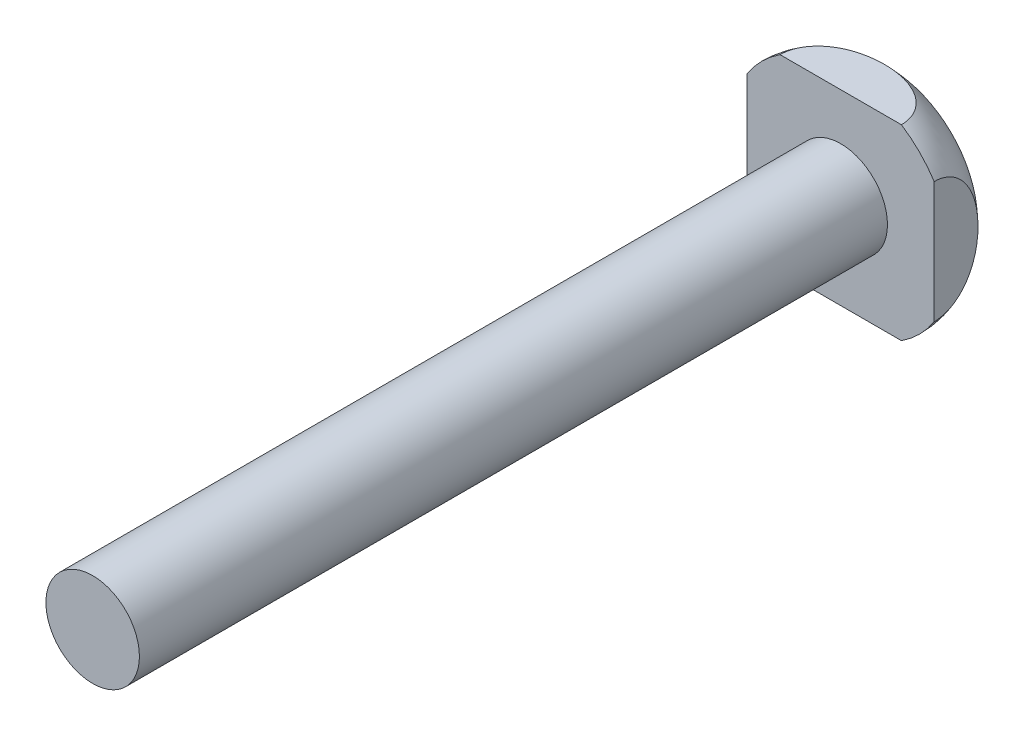
ISO-10303-21;
HEADER;
FILE_DESCRIPTION(('STEP AP214'),'2;1');
FILE_NAME('part.step','',(''),(''),'','','');
FILE_SCHEMA(('AUTOMOTIVE_DESIGN { 1 0 10303 214 1 1 1 1 }'));
ENDSEC;
DATA;
#1=APPLICATION_CONTEXT('core data for automotive mechanical design processes');
#2=APPLICATION_PROTOCOL_DEFINITION('international standard','automotive_design',2000,#1);
#3=PRODUCT_CONTEXT('',#1,'mechanical');
#4=PRODUCT('Part','Part','',(#3));
#5=PRODUCT_RELATED_PRODUCT_CATEGORY('part','',(#4));
#6=PRODUCT_DEFINITION_FORMATION('','',#4);
#7=PRODUCT_DEFINITION_CONTEXT('part definition',#1,'design');
#8=PRODUCT_DEFINITION('design','',#6,#7);
#9=PRODUCT_DEFINITION_SHAPE('','',#8);
#10=(LENGTH_UNIT() NAMED_UNIT(*) SI_UNIT(.MILLI.,.METRE.));
#11=(NAMED_UNIT(*) PLANE_ANGLE_UNIT() SI_UNIT($,.RADIAN.));
#12=(NAMED_UNIT(*) SI_UNIT($,.STERADIAN.) SOLID_ANGLE_UNIT());
#13=UNCERTAINTY_MEASURE_WITH_UNIT(LENGTH_MEASURE(1.E-05),#10,'distance_accuracy_value','');
#14=(GEOMETRIC_REPRESENTATION_CONTEXT(3) GLOBAL_UNCERTAINTY_ASSIGNED_CONTEXT((#13)) GLOBAL_UNIT_ASSIGNED_CONTEXT((#10,
#11,#12)) REPRESENTATION_CONTEXT('',''));
#15=CARTESIAN_POINT('',(0.,0.,0.));
#16=DIRECTION('',(0.,0.,1.));
#17=DIRECTION('',(1.,0.,0.));
#18=AXIS2_PLACEMENT_3D('',#15,#16,#17);
#19=CARTESIAN_POINT('',(12.,-12.,4.));
#20=DIRECTION('',(-1.,0.,0.));
#21=DIRECTION('',(0.,0.,1.));
#22=AXIS2_PLACEMENT_3D('',#19,#20,#21);
#23=PLANE('',#22);
#24=CARTESIAN_POINT('',(12.,0.,-1.61975235783045));
#25=CARTESIAN_POINT('',(12.,-0.298466554007829,-1.61975550867301));
#26=CARTESIAN_POINT('',(12.,-0.597008758637332,-1.60849802888015));
#27=CARTESIAN_POINT('',(12.,-1.1925151248952,-1.56310315724731));
#28=CARTESIAN_POINT('',(12.,-1.48947817761783,-1.52895139945406));
#29=CARTESIAN_POINT('',(12.,-2.08007288143527,-1.43664062732313));
#30=CARTESIAN_POINT('',(12.,-2.37370025860758,-1.37845375159281));
#31=CARTESIAN_POINT('',(12.,-2.95453105730461,-1.23647057917303));
#32=CARTESIAN_POINT('',(12.,-3.24173834680922,-1.15269017420627));
#33=CARTESIAN_POINT('',(12.,-3.89811625038402,-0.925823982661461));
#34=CARTESIAN_POINT('',(12.,-4.26379583796176,-0.772323227103074));
#35=CARTESIAN_POINT('',(12.,-4.9675013063137,-0.411846484318566));
#36=CARTESIAN_POINT('',(12.,-5.30558296186029,-0.204982052469957));
#37=CARTESIAN_POINT('',(12.,-5.87669289879187,0.218991285899276));
#38=CARTESIAN_POINT('',(12.,-6.11724798543279,0.42589957742616));
#39=CARTESIAN_POINT('',(12.,-6.5615788807165,0.876251572233164));
#40=CARTESIAN_POINT('',(12.,-6.76538803289601,1.11966178219319));
#41=CARTESIAN_POINT('',(12.,-7.09685163461541,1.59859678215695));
#42=CARTESIAN_POINT('',(12.,-7.23144862968998,1.82930271757107));
#43=CARTESIAN_POINT('',(12.,-7.46034601228005,2.31001092354894));
#44=CARTESIAN_POINT('',(12.,-7.55466363078995,2.56000488879766));
#45=CARTESIAN_POINT('',(12.,-7.6979962021923,3.07394016315601));
#46=CARTESIAN_POINT('',(12.,-7.7468147885182,3.33793677770163));
#47=CARTESIAN_POINT('',(12.,-7.79532805051749,3.87041665908822));
#48=CARTESIAN_POINT('',(12.,-7.79503388760656,4.13889889265445));
#49=CARTESIAN_POINT('',(12.,-7.74729145730835,4.65099295729728));
#50=CARTESIAN_POINT('',(12.,-7.70341646391772,4.89494826647288));
#51=CARTESIAN_POINT('',(12.,-7.57619544869537,5.37225267302241));
#52=CARTESIAN_POINT('',(12.,-7.49285111332349,5.60560222309606));
#53=CARTESIAN_POINT('',(12.,-7.28848342124842,6.06151725248239));
#54=CARTESIAN_POINT('',(12.,-7.16663495723922,6.283709614931));
#55=CARTESIAN_POINT('',(12.,-6.89130162551471,6.7075573749923));
#56=CARTESIAN_POINT('',(12.,-6.73780088209697,6.90920239062964));
#57=CARTESIAN_POINT('',(12.,-6.45650039158857,7.23073402568185));
#58=CARTESIAN_POINT('',(12.,-6.33543242424969,7.35662019135773));
#59=CARTESIAN_POINT('',(12.,-6.08269148966999,7.59729922320447));
#60=CARTESIAN_POINT('',(12.,-5.95101542947433,7.71208883238328));
#61=CARTESIAN_POINT('',(12.,-5.54232429852227,8.03986942339025));
#62=CARTESIAN_POINT('',(12.,-5.25178697625584,8.23611558106413));
#63=CARTESIAN_POINT('',(12.,-4.53484747390083,8.64976219751194));
#64=CARTESIAN_POINT('',(12.,-4.09773691343072,8.84845942474468));
#65=CARTESIAN_POINT('',(12.,-3.42317083437916,9.0926590576448));
#66=CARTESIAN_POINT('',(12.,-3.19480383269975,9.16515359127012));
#67=CARTESIAN_POINT('',(12.,-2.73337511598633,9.29325825342888));
#68=CARTESIAN_POINT('',(12.,-2.50031436178869,9.34887180087168));
#69=CARTESIAN_POINT('',(12.,-1.94954559694944,9.46070452562531));
#70=CARTESIAN_POINT('',(12.,-1.63052238803261,9.51044005371157));
#71=CARTESIAN_POINT('',(12.,-0.989343676371465,9.58276159993724));
#72=CARTESIAN_POINT('',(12.,-0.667186932848884,9.60533638209316));
#73=CARTESIAN_POINT('',(12.,-0.021989006068192,9.62413626638029));
#74=CARTESIAN_POINT('',(12.,0.301052472043571,9.62035113354797));
#75=CARTESIAN_POINT('',(12.,0.945651624620716,9.58627420056002));
#76=CARTESIAN_POINT('',(12.,1.26720977871829,9.55599167553519));
#77=CARTESIAN_POINT('',(12.,1.8377250228408,9.4773043801372));
#78=CARTESIAN_POINT('',(12.,2.08741127704584,9.43420330147638));
#79=CARTESIAN_POINT('',(12.,2.58295845740143,9.33011320342998));
#80=CARTESIAN_POINT('',(12.,2.82881931582113,9.26912386770108));
#81=CARTESIAN_POINT('',(12.,3.55721993473492,9.05781352957235));
#82=CARTESIAN_POINT('',(12.,4.03220964888022,8.87894252564371));
#83=CARTESIAN_POINT('',(12.,4.80867386518436,8.49914525293269));
#84=CARTESIAN_POINT('',(12.,5.12060732971218,8.31955145098619));
#85=CARTESIAN_POINT('',(12.,5.71262792892047,7.91362619660599));
#86=CARTESIAN_POINT('',(12.,5.99275320897774,7.68735166287566));
#87=CARTESIAN_POINT('',(12.,6.45920594600952,7.234490175787));
#88=CARTESIAN_POINT('',(12.,6.65326725176868,7.01595491139899));
#89=CARTESIAN_POINT('',(12.,6.9154282986369,6.6665833289026));
#90=CARTESIAN_POINT('',(12.,6.99802090094349,6.54647867637287));
#91=CARTESIAN_POINT('',(12.,7.15249581472533,6.29959540317193));
#92=CARTESIAN_POINT('',(12.,7.22438283631547,6.17281975095218));
#93=CARTESIAN_POINT('',(12.,7.35694830140558,5.91223708147905));
#94=CARTESIAN_POINT('',(12.,7.417531719838,5.77838162162528));
#95=CARTESIAN_POINT('',(12.,7.52575935458442,5.50559863889703));
#96=CARTESIAN_POINT('',(12.,7.57341005971335,5.36667369940827));
#97=CARTESIAN_POINT('',(12.,7.65496137322529,5.08487941543659));
#98=CARTESIAN_POINT('',(12.,7.68886603357977,4.94201124659605));
#99=CARTESIAN_POINT('',(12.,7.74230973093886,4.65361775230715));
#100=CARTESIAN_POINT('',(12.,7.76185076478635,4.50809279909094));
#101=CARTESIAN_POINT('',(12.,7.7846512455825,4.23440598068292));
#102=CARTESIAN_POINT('',(12.,7.78966399814934,4.10638742532634));
#103=CARTESIAN_POINT('',(12.,7.78839389175419,3.85036069666087));
#104=CARTESIAN_POINT('',(12.,7.78210729914414,3.72235254076593));
#105=CARTESIAN_POINT('',(12.,7.75832602569497,3.46746151172275));
#106=CARTESIAN_POINT('',(12.,7.74083859184595,3.34057796472441));
#107=CARTESIAN_POINT('',(12.,7.69493235184216,3.08878895792154));
#108=CARTESIAN_POINT('',(12.,7.66650942835674,2.96388426164065));
#109=CARTESIAN_POINT('',(12.,7.56791166110968,2.6027802265585));
#110=CARTESIAN_POINT('',(12.,7.48342097039186,2.37034217000962));
#111=CARTESIAN_POINT('',(12.,7.27942568016087,1.92162738929754));
#112=CARTESIAN_POINT('',(12.,7.15991465501677,1.70535364015555));
#113=CARTESIAN_POINT('',(12.,6.88023889311771,1.2760675248153));
#114=CARTESIAN_POINT('',(12.,6.71760458662428,1.06466910994155));
#115=CARTESIAN_POINT('',(12.,6.36405028013933,0.667224685964034));
#116=CARTESIAN_POINT('',(12.,6.17311758452764,0.481190128243367));
#117=CARTESIAN_POINT('',(12.,5.67030593117174,0.0506119393328387));
#118=CARTESIAN_POINT('',(12.,5.34488834483769,-0.178155390076068));
#119=CARTESIAN_POINT('',(12.,4.66112610908935,-0.580542904290289));
#120=CARTESIAN_POINT('',(12.,4.3026882400531,-0.754000386950349));
#121=CARTESIAN_POINT('',(12.,3.67538488506169,-1.00604484162095));
#122=CARTESIAN_POINT('',(12.,3.41153326972042,-1.09750788243165));
#123=CARTESIAN_POINT('',(12.,2.87674770836442,-1.2571816931407));
#124=CARTESIAN_POINT('',(12.,2.60581004074615,-1.32537996915668));
#125=CARTESIAN_POINT('',(12.,2.05979842091308,-1.4399361231315));
#126=CARTESIAN_POINT('',(12.,1.78473036451184,-1.48632255005808));
#127=CARTESIAN_POINT('',(12.,1.23205480203347,-1.55856392387324));
#128=CARTESIAN_POINT('',(12.,0.954448733415401,-1.58442984270939));
#129=CARTESIAN_POINT('',(12.,0.563732520240885,-1.6068542719981));
#130=CARTESIAN_POINT('',(12.,0.45104379065763,-1.61169335728056));
#131=CARTESIAN_POINT('',(12.,0.225573642385758,-1.61814181480218));
#132=CARTESIAN_POINT('',(12.,0.1127922231294,-1.61975116710897));
#133=CARTESIAN_POINT('',(12.,0.,-1.61975235783045));
#134=B_SPLINE_CURVE_WITH_KNOTS('',3,(#24,#25,#26,#27,#28,#29,#30,#31,#32,#33,#34,#35,#36,#37,
#38,#39,#40,#41,#42,#43,#44,#45,#46,#47,#48,#49,#50,#51,#52,#53,#54,#55,#56,#57,#58,#59,#60,#61,
#62,#63,#64,#65,#66,#67,#68,#69,#70,#71,#72,#73,#74,#75,#76,#77,#78,#79,#80,#81,#82,#83,#84,#85,
#86,#87,#88,#89,#90,#91,#92,#93,#94,#95,#96,#97,#98,#99,#100,#101,#102,#103,#104,#105,#106,#107,
#108,#109,#110,#111,#112,#113,#114,#115,#116,#117,#118,#119,#120,#121,#122,#123,#124,#125,#126,
#127,#128,#129,#130,#131,#132,#133),.UNSPECIFIED.,.T.,.F.,(4,2,2,2,2,2,2,2,2,2,2,2,2,2,2,2,2,2,
2,2,2,2,2,2,2,2,2,2,2,2,2,2,2,2,2,2,2,2,2,2,2,2,2,2,2,2,2,2,2,2,2,2,2,2,4),(0.,0.89531218048201,
1.79118668781589,2.68810261593464,3.58446275252424,4.770357001256,5.95379197997918,
6.90210812072885,7.84955937326967,8.64747457460766,9.44504809542897,10.2460480893913,
11.0468660474902,11.7870277689419,12.5271578673583,13.2843673657936,14.0419575825065,
14.5652664940549,15.0887285405478,16.1362758930691,17.5685684524413,18.2869020061464,
19.0050899783989,19.9724406092927,20.9401912808425,21.9083177292077,22.8761054306946,
23.6355826867945,24.3950733746136,25.9091647428657,26.9854543027693,28.0604391976304,
28.9333835024724,29.3702073568078,29.8068384511201,30.2469892823801,30.6869188639019,
31.1267186713356,31.5664573258775,31.9503211393757,32.3343118164982,32.7180543007014,
33.1019414097351,33.8404017327316,34.578997635468,35.3760714802693,36.1735040080612,
37.3602501958609,38.5504558398044,39.387175981315,40.2243447620652,41.0604147229452,
41.896037350363,42.2343788718977,42.5727224815094),.UNSPECIFIED.);
#135=CARTESIAN_POINT('',(12.,7.78908263224708,4.));
#136=VERTEX_POINT('',#135);
#137=CARTESIAN_POINT('',(12.,-7.78908263224708,4.));
#138=VERTEX_POINT('',#137);
#139=EDGE_CURVE('E105',#136,#138,#134,.T.);
#140=ORIENTED_EDGE('',*,*,#139,.F.);
#141=DIRECTION('',(0.,1.,0.));
#142=VECTOR('',#141,1.);
#143=CARTESIAN_POINT('',(12.,-12.,4.));
#144=LINE('',#143,#142);
#145=EDGE_CURVE('E97',#138,#136,#144,.T.);
#146=ORIENTED_EDGE('',*,*,#145,.F.);
#147=EDGE_LOOP('',(#140,#146));
#148=FACE_BOUND('',#147,.T.);
#149=ADVANCED_FACE('F38',(#148),#23,.F.);
#150=CARTESIAN_POINT('',(-12.,12.,4.));
#151=DIRECTION('',(0.,-1.,0.));
#152=DIRECTION('',(0.,0.,-1.));
#153=AXIS2_PLACEMENT_3D('',#150,#151,#152);
#154=PLANE('',#153);
#155=CARTESIAN_POINT('',(0.,12.,-1.61975235783044));
#156=CARTESIAN_POINT('',(0.298466554007838,12.,-1.61975550867301));
#157=CARTESIAN_POINT('',(0.597008758637342,12.,-1.60849802888015));
#158=CARTESIAN_POINT('',(1.19251512489521,12.,-1.5631031572473));
#159=CARTESIAN_POINT('',(1.48947817761784,12.,-1.52895139945405));
#160=CARTESIAN_POINT('',(2.08007288143528,12.,-1.43664062732312));
#161=CARTESIAN_POINT('',(2.37370025860759,12.,-1.3784537515928));
#162=CARTESIAN_POINT('',(2.95453105730462,12.,-1.23647057917302));
#163=CARTESIAN_POINT('',(3.24173834680923,12.,-1.15269017420626));
#164=CARTESIAN_POINT('',(3.89811625038403,12.,-0.925823982661443));
#165=CARTESIAN_POINT('',(4.26379583796177,12.,-0.772323227103058));
#166=CARTESIAN_POINT('',(4.96750130631371,12.,-0.411846484318553));
#167=CARTESIAN_POINT('',(5.3055829618603,12.,-0.204982052469943));
#168=CARTESIAN_POINT('',(5.87669289879188,12.,0.218991285899291));
#169=CARTESIAN_POINT('',(6.11724798543279,12.,0.425899577426175));
#170=CARTESIAN_POINT('',(6.5615788807165,12.,0.876251572233179));
#171=CARTESIAN_POINT('',(6.76538803289601,12.,1.1196617821932));
#172=CARTESIAN_POINT('',(7.09685163461541,12.,1.59859678215696));
#173=CARTESIAN_POINT('',(7.23144862968997,12.,1.82930271757108));
#174=CARTESIAN_POINT('',(7.46034601228004,12.,2.31001092354895));
#175=CARTESIAN_POINT('',(7.55466363078994,12.,2.56000488879768));
#176=CARTESIAN_POINT('',(7.69799620219229,12.,3.07394016315603));
#177=CARTESIAN_POINT('',(7.74681478851819,12.,3.33793677770164));
#178=CARTESIAN_POINT('',(7.79532805051748,12.,3.87041665908823));
#179=CARTESIAN_POINT('',(7.79503388760655,12.,4.13889889265446));
#180=CARTESIAN_POINT('',(7.74729145730834,12.,4.65099295729729));
#181=CARTESIAN_POINT('',(7.7034164639177,12.,4.89494826647289));
#182=CARTESIAN_POINT('',(7.57619544869536,12.,5.37225267302242));
#183=CARTESIAN_POINT('',(7.49285111332347,12.,5.60560222309607));
#184=CARTESIAN_POINT('',(7.28848342124841,12.,6.0615172524824));
#185=CARTESIAN_POINT('',(7.16663495723921,12.,6.28370961493101));
#186=CARTESIAN_POINT('',(6.8913016255147,12.,6.7075573749923));
#187=CARTESIAN_POINT('',(6.73780088209696,12.,6.90920239062964));
#188=CARTESIAN_POINT('',(6.45650039158855,12.,7.23073402568186));
#189=CARTESIAN_POINT('',(6.33543242424968,12.,7.35662019135773));
#190=CARTESIAN_POINT('',(6.08269148966997,12.,7.59729922320447));
#191=CARTESIAN_POINT('',(5.95101542947431,12.,7.71208883238328));
#192=CARTESIAN_POINT('',(5.54232429852225,12.,8.03986942339025));
#193=CARTESIAN_POINT('',(5.25178697625581,12.,8.23611558106413));
#194=CARTESIAN_POINT('',(4.53484747390081,12.,8.64976219751194));
#195=CARTESIAN_POINT('',(4.0977369134307,12.,8.84845942474468));
#196=CARTESIAN_POINT('',(3.42317083437913,12.,9.0926590576448));
#197=CARTESIAN_POINT('',(3.19480383269973,12.,9.16515359127012));
#198=CARTESIAN_POINT('',(2.7333751159863,12.,9.29325825342888));
#199=CARTESIAN_POINT('',(2.50031436178867,12.,9.34887180087168));
#200=CARTESIAN_POINT('',(1.94954559694942,12.,9.46070452562531));
#201=CARTESIAN_POINT('',(1.63052238803258,12.,9.51044005371157));
#202=CARTESIAN_POINT('',(0.989343676371439,12.,9.58276159993723));
#203=CARTESIAN_POINT('',(0.667186932848859,12.,9.60533638209316));
#204=CARTESIAN_POINT('',(0.0219890060681676,12.,9.62413626638028));
#205=CARTESIAN_POINT('',(-0.301052472043596,12.,9.62035113354796));
#206=CARTESIAN_POINT('',(-0.94565162462074,12.,9.58627420056));
#207=CARTESIAN_POINT('',(-1.26720977871831,12.,9.55599167553518));
#208=CARTESIAN_POINT('',(-1.83772502284082,12.,9.47730438013719));
#209=CARTESIAN_POINT('',(-2.08741127704586,12.,9.43420330147637));
#210=CARTESIAN_POINT('',(-2.58295845740145,12.,9.33011320342997));
#211=CARTESIAN_POINT('',(-2.82881931582115,12.,9.26912386770107));
#212=CARTESIAN_POINT('',(-3.55721993473493,12.,9.05781352957234));
#213=CARTESIAN_POINT('',(-4.03220964888023,12.,8.8789425256437));
#214=CARTESIAN_POINT('',(-4.80867386518437,12.,8.49914525293268));
#215=CARTESIAN_POINT('',(-5.12060732971219,12.,8.31955145098617));
#216=CARTESIAN_POINT('',(-5.71262792892047,12.,7.91362619660598));
#217=CARTESIAN_POINT('',(-5.99275320897775,12.,7.68735166287564));
#218=CARTESIAN_POINT('',(-6.45920594600952,12.,7.23449017578699));
#219=CARTESIAN_POINT('',(-6.65326725176868,12.,7.01595491139897));
#220=CARTESIAN_POINT('',(-6.9154282986369,12.,6.66658332890259));
#221=CARTESIAN_POINT('',(-6.99802090094349,12.,6.54647867637285));
#222=CARTESIAN_POINT('',(-7.15249581472533,12.,6.29959540317191));
#223=CARTESIAN_POINT('',(-7.22438283631547,12.,6.17281975095217));
#224=CARTESIAN_POINT('',(-7.35694830140558,12.,5.91223708147904));
#225=CARTESIAN_POINT('',(-7.417531719838,12.,5.77838162162527));
#226=CARTESIAN_POINT('',(-7.52575935458442,12.,5.50559863889702));
#227=CARTESIAN_POINT('',(-7.57341005971334,12.,5.36667369940826));
#228=CARTESIAN_POINT('',(-7.65496137322528,12.,5.08487941543657));
#229=CARTESIAN_POINT('',(-7.68886603357976,12.,4.94201124659604));
#230=CARTESIAN_POINT('',(-7.74230973093885,12.,4.65361775230714));
#231=CARTESIAN_POINT('',(-7.76185076478635,12.,4.50809279909094));
#232=CARTESIAN_POINT('',(-7.78465124558249,12.,4.23440598068292));
#233=CARTESIAN_POINT('',(-7.78966399814933,12.,4.10638742532633));
#234=CARTESIAN_POINT('',(-7.78839389175418,12.,3.85036069666087));
#235=CARTESIAN_POINT('',(-7.78210729914413,12.,3.72235254076592));
#236=CARTESIAN_POINT('',(-7.75832602569496,12.,3.46746151172275));
#237=CARTESIAN_POINT('',(-7.74083859184593,12.,3.34057796472441));
#238=CARTESIAN_POINT('',(-7.69493235184214,12.,3.08878895792153));
#239=CARTESIAN_POINT('',(-7.66650942835672,12.,2.96388426164065));
#240=CARTESIAN_POINT('',(-7.56791166110966,12.,2.60278022655849));
#241=CARTESIAN_POINT('',(-7.48342097039184,12.,2.37034217000961));
#242=CARTESIAN_POINT('',(-7.27942568016086,12.,1.92162738929753));
#243=CARTESIAN_POINT('',(-7.15991465501676,12.,1.70535364015555));
#244=CARTESIAN_POINT('',(-6.8802388931177,12.,1.2760675248153));
#245=CARTESIAN_POINT('',(-6.71760458662427,12.,1.06466910994154));
#246=CARTESIAN_POINT('',(-6.36405028013932,12.,0.66722468596403));
#247=CARTESIAN_POINT('',(-6.17311758452763,12.,0.481190128243367));
#248=CARTESIAN_POINT('',(-5.67030593117172,12.,0.0506119393328399));
#249=CARTESIAN_POINT('',(-5.34488834483767,12.,-0.17815539007607));
#250=CARTESIAN_POINT('',(-4.66112610908933,12.,-0.580542904290291));
#251=CARTESIAN_POINT('',(-4.30268824005308,12.,-0.754000386950347));
#252=CARTESIAN_POINT('',(-3.67538488506168,12.,-1.00604484162095));
#253=CARTESIAN_POINT('',(-3.41153326972041,12.,-1.09750788243165));
#254=CARTESIAN_POINT('',(-2.87674770836441,12.,-1.2571816931407));
#255=CARTESIAN_POINT('',(-2.60581004074615,12.,-1.32537996915667));
#256=CARTESIAN_POINT('',(-2.05979842091308,12.,-1.43993612313149));
#257=CARTESIAN_POINT('',(-1.78473036451183,12.,-1.48632255005808));
#258=CARTESIAN_POINT('',(-1.23205480203346,12.,-1.55856392387323));
#259=CARTESIAN_POINT('',(-0.954448733415394,12.,-1.58442984270939));
#260=CARTESIAN_POINT('',(-0.563732520240875,12.,-1.60685427199809));
#261=CARTESIAN_POINT('',(-0.451043790657621,12.,-1.61169335728055));
#262=CARTESIAN_POINT('',(-0.225573642385749,12.,-1.61814181480218));
#263=CARTESIAN_POINT('',(-0.112792223129391,12.,-1.61975116710896));
#264=CARTESIAN_POINT('',(0.,12.,-1.61975235783044));
#265=B_SPLINE_CURVE_WITH_KNOTS('',3,(#155,#156,#157,#158,#159,#160,#161,#162,#163,#164,#165,
#166,#167,#168,#169,#170,#171,#172,#173,#174,#175,#176,#177,#178,#179,#180,#181,#182,#183,#184,
#185,#186,#187,#188,#189,#190,#191,#192,#193,#194,#195,#196,#197,#198,#199,#200,#201,#202,#203,
#204,#205,#206,#207,#208,#209,#210,#211,#212,#213,#214,#215,#216,#217,#218,#219,#220,#221,#222,
#223,#224,#225,#226,#227,#228,#229,#230,#231,#232,#233,#234,#235,#236,#237,#238,#239,#240,#241,
#242,#243,#244,#245,#246,#247,#248,#249,#250,#251,#252,#253,#254,#255,#256,#257,#258,#259,#260,
#261,#262,#263,#264),.UNSPECIFIED.,.T.,.F.,(4,2,2,2,2,2,2,2,2,2,2,2,2,2,2,2,2,2,2,2,2,2,2,2,2,2,
2,2,2,2,2,2,2,2,2,2,2,2,2,2,2,2,2,2,2,2,2,2,2,2,2,2,2,2,4),(0.,0.895312180482012,
1.7911866878159,2.68810261593464,3.58446275252424,4.770357001256,5.95379197997918,
6.90210812072884,7.84955937326967,8.64747457460765,9.44504809542896,10.2460480893913,
11.0468660474902,11.7870277689419,12.5271578673583,13.2843673657936,14.0419575825065,
14.5652664940549,15.0887285405478,16.1362758930691,17.5685684524413,18.2869020061464,
19.0050899783989,19.9724406092927,20.9401912808425,21.9083177292076,22.8761054306946,
23.6355826867945,24.3950733746136,25.9091647428657,26.9854543027693,28.0604391976304,
28.9333835024724,29.3702073568078,29.8068384511201,30.2469892823801,30.6869188639019,
31.1267186713356,31.5664573258775,31.9503211393757,32.3343118164981,32.7180543007014,
33.101941409735,33.8404017327315,34.5789976354679,35.3760714802692,36.1735040080611,
37.3602501958609,38.5504558398043,39.387175981315,40.2243447620651,41.0604147229451,
41.896037350363,42.2343788718976,42.5727224815094),.UNSPECIFIED.);
#266=CARTESIAN_POINT('',(-7.78908263224707,12.,4.));
#267=VERTEX_POINT('',#266);
#268=CARTESIAN_POINT('',(7.78908263224706,12.,4.));
#269=VERTEX_POINT('',#268);
#270=EDGE_CURVE('E83',#267,#269,#265,.T.);
#271=ORIENTED_EDGE('',*,*,#270,.F.);
#272=DIRECTION('',(-1.,0.,0.));
#273=VECTOR('',#272,1.);
#274=CARTESIAN_POINT('',(-12.,12.,4.));
#275=LINE('',#274,#273);
#276=EDGE_CURVE('E91',#269,#267,#275,.T.);
#277=ORIENTED_EDGE('',*,*,#276,.F.);
#278=EDGE_LOOP('',(#271,#277));
#279=FACE_BOUND('',#278,.T.);
#280=ADVANCED_FACE('F137',(#279),#154,.F.);
#281=CARTESIAN_POINT('',(-12.,-12.,4.));
#282=DIRECTION('',(1.,0.,0.));
#283=DIRECTION('',(0.,0.,-1.));
#284=AXIS2_PLACEMENT_3D('',#281,#282,#283);
#285=PLANE('',#284);
#286=CARTESIAN_POINT('',(-12.,0.,-1.61975235783045));
#287=CARTESIAN_POINT('',(-12.,0.298466554007846,-1.61975550867301));
#288=CARTESIAN_POINT('',(-12.,0.597008758637349,-1.60849802888015));
#289=CARTESIAN_POINT('',(-12.,1.19251512489521,-1.56310315724731));
#290=CARTESIAN_POINT('',(-12.,1.48947817761785,-1.52895139945406));
#291=CARTESIAN_POINT('',(-12.,2.08007288143529,-1.43664062732313));
#292=CARTESIAN_POINT('',(-12.,2.3737002586076,-1.37845375159281));
#293=CARTESIAN_POINT('',(-12.,2.95453105730462,-1.23647057917303));
#294=CARTESIAN_POINT('',(-12.,3.24173834680923,-1.15269017420627));
#295=CARTESIAN_POINT('',(-12.,3.89811625038404,-0.925823982661452));
#296=CARTESIAN_POINT('',(-12.,4.26379583796178,-0.772323227103066));
#297=CARTESIAN_POINT('',(-12.,4.96750130631371,-0.411846484318561));
#298=CARTESIAN_POINT('',(-12.,5.3055829618603,-0.204982052469952));
#299=CARTESIAN_POINT('',(-12.,5.87669289879188,0.21899128589928));
#300=CARTESIAN_POINT('',(-12.,6.1172479854328,0.425899577426166));
#301=CARTESIAN_POINT('',(-12.,6.56157888071651,0.876251572233171));
#302=CARTESIAN_POINT('',(-12.,6.76538803289602,1.11966178219319));
#303=CARTESIAN_POINT('',(-12.,7.09685163461542,1.59859678215696));
#304=CARTESIAN_POINT('',(-12.,7.23144862968998,1.82930271757108));
#305=CARTESIAN_POINT('',(-12.,7.46034601228005,2.31001092354894));
#306=CARTESIAN_POINT('',(-12.,7.55466363078995,2.56000488879767));
#307=CARTESIAN_POINT('',(-12.,7.6979962021923,3.07394016315602));
#308=CARTESIAN_POINT('',(-12.,7.7468147885182,3.33793677770163));
#309=CARTESIAN_POINT('',(-12.,7.79532805051749,3.87041665908822));
#310=CARTESIAN_POINT('',(-12.,7.79503388760656,4.13889889265445));
#311=CARTESIAN_POINT('',(-12.,7.74729145730835,4.65099295729728));
#312=CARTESIAN_POINT('',(-12.,7.70341646391771,4.89494826647288));
#313=CARTESIAN_POINT('',(-12.,7.57619544869537,5.37225267302241));
#314=CARTESIAN_POINT('',(-12.,7.49285111332348,5.60560222309606));
#315=CARTESIAN_POINT('',(-12.,7.28848342124842,6.06151725248239));
#316=CARTESIAN_POINT('',(-12.,7.16663495723922,6.28370961493101));
#317=CARTESIAN_POINT('',(-12.,6.89130162551471,6.7075573749923));
#318=CARTESIAN_POINT('',(-12.,6.73780088209697,6.90920239062964));
#319=CARTESIAN_POINT('',(-12.,6.45650039158857,7.23073402568185));
#320=CARTESIAN_POINT('',(-12.,6.33543242424969,7.35662019135773));
#321=CARTESIAN_POINT('',(-12.,6.08269148966998,7.59729922320447));
#322=CARTESIAN_POINT('',(-12.,5.95101542947432,7.71208883238328));
#323=CARTESIAN_POINT('',(-12.,5.54232429852226,8.03986942339024));
#324=CARTESIAN_POINT('',(-12.,5.25178697625583,8.23611558106413));
#325=CARTESIAN_POINT('',(-12.,4.53484747390083,8.64976219751194));
#326=CARTESIAN_POINT('',(-12.,4.09773691343072,8.84845942474468));
#327=CARTESIAN_POINT('',(-12.,3.42317083437915,9.0926590576448));
#328=CARTESIAN_POINT('',(-12.,3.19480383269975,9.16515359127012));
#329=CARTESIAN_POINT('',(-12.,2.73337511598633,9.29325825342888));
#330=CARTESIAN_POINT('',(-12.,2.50031436178869,9.34887180087168));
#331=CARTESIAN_POINT('',(-12.,1.94954559694944,9.46070452562531));
#332=CARTESIAN_POINT('',(-12.,1.63052238803261,9.51044005371157));
#333=CARTESIAN_POINT('',(-12.,0.989343676371466,9.58276159993723));
#334=CARTESIAN_POINT('',(-12.,0.667186932848884,9.60533638209316));
#335=CARTESIAN_POINT('',(-12.,0.0219890060681911,9.62413626638028));
#336=CARTESIAN_POINT('',(-12.,-0.301052472043573,9.62035113354796));
#337=CARTESIAN_POINT('',(-12.,-0.945651624620717,9.58627420056001));
#338=CARTESIAN_POINT('',(-12.,-1.26720977871829,9.55599167553519));
#339=CARTESIAN_POINT('',(-12.,-1.8377250228408,9.4773043801372));
#340=CARTESIAN_POINT('',(-12.,-2.08741127704584,9.43420330147638));
#341=CARTESIAN_POINT('',(-12.,-2.58295845740143,9.33011320342998));
#342=CARTESIAN_POINT('',(-12.,-2.82881931582113,9.26912386770108));
#343=CARTESIAN_POINT('',(-12.,-3.55721993473492,9.05781352957235));
#344=CARTESIAN_POINT('',(-12.,-4.03220964888022,8.87894252564371));
#345=CARTESIAN_POINT('',(-12.,-4.80867386518436,8.49914525293269));
#346=CARTESIAN_POINT('',(-12.,-5.12060732971218,8.31955145098619));
#347=CARTESIAN_POINT('',(-12.,-5.71262792892046,7.91362619660599));
#348=CARTESIAN_POINT('',(-12.,-5.99275320897774,7.68735166287566));
#349=CARTESIAN_POINT('',(-12.,-6.45920594600952,7.234490175787));
#350=CARTESIAN_POINT('',(-12.,-6.65326725176868,7.01595491139899));
#351=CARTESIAN_POINT('',(-12.,-6.9154282986369,6.6665833289026));
#352=CARTESIAN_POINT('',(-12.,-6.9980209009435,6.54647867637287));
#353=CARTESIAN_POINT('',(-12.,-7.15249581472533,6.29959540317193));
#354=CARTESIAN_POINT('',(-12.,-7.22438283631547,6.17281975095218));
#355=CARTESIAN_POINT('',(-12.,-7.35694830140558,5.91223708147904));
#356=CARTESIAN_POINT('',(-12.,-7.417531719838,5.77838162162528));
#357=CARTESIAN_POINT('',(-12.,-7.52575935458442,5.50559863889703));
#358=CARTESIAN_POINT('',(-12.,-7.57341005971335,5.36667369940827));
#359=CARTESIAN_POINT('',(-12.,-7.65496137322529,5.08487941543658));
#360=CARTESIAN_POINT('',(-12.,-7.68886603357977,4.94201124659605));
#361=CARTESIAN_POINT('',(-12.,-7.74230973093886,4.65361775230715));
#362=CARTESIAN_POINT('',(-12.,-7.76185076478635,4.50809279909094));
#363=CARTESIAN_POINT('',(-12.,-7.7846512455825,4.23440598068292));
#364=CARTESIAN_POINT('',(-12.,-7.78966399814934,4.10638742532634));
#365=CARTESIAN_POINT('',(-12.,-7.7883938917542,3.85036069666087));
#366=CARTESIAN_POINT('',(-12.,-7.78210729914414,3.72235254076592));
#367=CARTESIAN_POINT('',(-12.,-7.75832602569497,3.46746151172275));
#368=CARTESIAN_POINT('',(-12.,-7.74083859184595,3.34057796472441));
#369=CARTESIAN_POINT('',(-12.,-7.69493235184216,3.08878895792153));
#370=CARTESIAN_POINT('',(-12.,-7.66650942835674,2.96388426164065));
#371=CARTESIAN_POINT('',(-12.,-7.56791166110967,2.6027802265585));
#372=CARTESIAN_POINT('',(-12.,-7.48342097039186,2.37034217000961));
#373=CARTESIAN_POINT('',(-12.,-7.27942568016088,1.92162738929753));
#374=CARTESIAN_POINT('',(-12.,-7.15991465501677,1.70535364015555));
#375=CARTESIAN_POINT('',(-12.,-6.88023889311771,1.2760675248153));
#376=CARTESIAN_POINT('',(-12.,-6.71760458662428,1.06466910994155));
#377=CARTESIAN_POINT('',(-12.,-6.36405028013933,0.667224685964032));
#378=CARTESIAN_POINT('',(-12.,-6.17311758452764,0.481190128243367));
#379=CARTESIAN_POINT('',(-12.,-5.67030593117174,0.0506119393328394));
#380=CARTESIAN_POINT('',(-12.,-5.34488834483769,-0.178155390076069));
#381=CARTESIAN_POINT('',(-12.,-4.66112610908935,-0.580542904290291));
#382=CARTESIAN_POINT('',(-12.,-4.3026882400531,-0.754000386950348));
#383=CARTESIAN_POINT('',(-12.,-3.6753848850617,-1.00604484162095));
#384=CARTESIAN_POINT('',(-12.,-3.41153326972043,-1.09750788243165));
#385=CARTESIAN_POINT('',(-12.,-2.87674770836442,-1.2571816931407));
#386=CARTESIAN_POINT('',(-12.,-2.60581004074616,-1.32537996915668));
#387=CARTESIAN_POINT('',(-12.,-2.05979842091308,-1.4399361231315));
#388=CARTESIAN_POINT('',(-12.,-1.78473036451184,-1.48632255005809));
#389=CARTESIAN_POINT('',(-12.,-1.23205480203347,-1.55856392387324));
#390=CARTESIAN_POINT('',(-12.,-0.954448733415401,-1.58442984270939));
#391=CARTESIAN_POINT('',(-12.,-0.563732520240883,-1.6068542719981));
#392=CARTESIAN_POINT('',(-12.,-0.451043790657627,-1.61169335728056));
#393=CARTESIAN_POINT('',(-12.,-0.225573642385749,-1.61814181480219));
#394=CARTESIAN_POINT('',(-12.,-0.112792223129387,-1.61975116710897));
#395=CARTESIAN_POINT('',(-12.,0.,-1.61975235783045));
#396=B_SPLINE_CURVE_WITH_KNOTS('',3,(#286,#287,#288,#289,#290,#291,#292,#293,#294,#295,#296,
#297,#298,#299,#300,#301,#302,#303,#304,#305,#306,#307,#308,#309,#310,#311,#312,#313,#314,#315,
#316,#317,#318,#319,#320,#321,#322,#323,#324,#325,#326,#327,#328,#329,#330,#331,#332,#333,#334,
#335,#336,#337,#338,#339,#340,#341,#342,#343,#344,#345,#346,#347,#348,#349,#350,#351,#352,#353,
#354,#355,#356,#357,#358,#359,#360,#361,#362,#363,#364,#365,#366,#367,#368,#369,#370,#371,#372,
#373,#374,#375,#376,#377,#378,#379,#380,#381,#382,#383,#384,#385,#386,#387,#388,#389,#390,#391,
#392,#393,#394,#395),.UNSPECIFIED.,.T.,.F.,(4,2,2,2,2,2,2,2,2,2,2,2,2,2,2,2,2,2,2,2,2,2,2,2,2,2,
2,2,2,2,2,2,2,2,2,2,2,2,2,2,2,2,2,2,2,2,2,2,2,2,2,2,2,2,4),(0.,0.895312180482011,
1.79118668781589,2.68810261593464,3.58446275252424,4.770357001256,5.95379197997917,
6.90210812072884,7.84955937326967,8.64747457460765,9.44504809542896,10.2460480893913,
11.0468660474902,11.7870277689419,12.5271578673583,13.2843673657936,14.0419575825065,
14.5652664940549,15.0887285405478,16.1362758930691,17.5685684524413,18.2869020061464,
19.0050899783989,19.9724406092927,20.9401912808425,21.9083177292076,22.8761054306946,
23.6355826867945,24.3950733746136,25.9091647428657,26.9854543027693,28.0604391976304,
28.9333835024724,29.3702073568078,29.8068384511201,30.2469892823801,30.6869188639019,
31.1267186713356,31.5664573258775,31.9503211393757,32.3343118164982,32.7180543007014,
33.1019414097351,33.8404017327315,34.578997635468,35.3760714802693,36.1735040080612,
37.3602501958609,38.5504558398044,39.387175981315,40.2243447620652,41.0604147229452,
41.896037350363,42.2343788718977,42.5727224815094),.UNSPECIFIED.);
#397=CARTESIAN_POINT('',(-12.,-7.78908263224708,4.));
#398=VERTEX_POINT('',#397);
#399=CARTESIAN_POINT('',(-12.,7.78908263224708,4.));
#400=VERTEX_POINT('',#399);
#401=EDGE_CURVE('E75',#398,#400,#396,.T.);
#402=ORIENTED_EDGE('',*,*,#401,.F.);
#403=DIRECTION('',(0.,-1.,0.));
#404=VECTOR('',#403,1.);
#405=CARTESIAN_POINT('',(-12.,-12.,4.));
#406=LINE('',#405,#404);
#407=EDGE_CURVE('E88',#400,#398,#406,.T.);
#408=ORIENTED_EDGE('',*,*,#407,.F.);
#409=EDGE_LOOP('',(#402,#408));
#410=FACE_BOUND('',#409,.T.);
#411=ADVANCED_FACE('F95',(#410),#285,.F.);
#412=CARTESIAN_POINT('',(-12.,-12.,4.));
#413=DIRECTION('',(0.,1.,0.));
#414=DIRECTION('',(0.,0.,1.));
#415=AXIS2_PLACEMENT_3D('',#412,#413,#414);
#416=PLANE('',#415);
#417=CARTESIAN_POINT('',(0.,-12.,-1.61975235783046));
#418=CARTESIAN_POINT('',(-0.298466554007837,-12.,-1.61975550867302));
#419=CARTESIAN_POINT('',(-0.59700875863734,-12.,-1.60849802888016));
#420=CARTESIAN_POINT('',(-1.1925151248952,-12.,-1.56310315724731));
#421=CARTESIAN_POINT('',(-1.48947817761784,-12.,-1.52895139945407));
#422=CARTESIAN_POINT('',(-2.08007288143528,-12.,-1.43664062732313));
#423=CARTESIAN_POINT('',(-2.37370025860759,-12.,-1.37845375159282));
#424=CARTESIAN_POINT('',(-2.95453105730461,-12.,-1.23647057917304));
#425=CARTESIAN_POINT('',(-3.24173834680922,-12.,-1.15269017420628));
#426=CARTESIAN_POINT('',(-3.89811625038403,-12.,-0.925823982661466));
#427=CARTESIAN_POINT('',(-4.26379583796177,-12.,-0.772323227103078));
#428=CARTESIAN_POINT('',(-4.96750130631371,-12.,-0.411846484318571));
#429=CARTESIAN_POINT('',(-5.3055829618603,-12.,-0.204982052469961));
#430=CARTESIAN_POINT('',(-5.87669289879188,-12.,0.21899128589927));
#431=CARTESIAN_POINT('',(-6.1172479854328,-12.,0.425899577426153));
#432=CARTESIAN_POINT('',(-6.56157888071651,-12.,0.876251572233158));
#433=CARTESIAN_POINT('',(-6.76538803289603,-12.,1.11966178219318));
#434=CARTESIAN_POINT('',(-7.09685163461542,-12.,1.59859678215695));
#435=CARTESIAN_POINT('',(-7.23144862968999,-12.,1.82930271757107));
#436=CARTESIAN_POINT('',(-7.46034601228006,-12.,2.31001092354893));
#437=CARTESIAN_POINT('',(-7.55466363078996,-12.,2.56000488879766));
#438=CARTESIAN_POINT('',(-7.69799620219231,-12.,3.07394016315601));
#439=CARTESIAN_POINT('',(-7.74681478851821,-12.,3.33793677770163));
#440=CARTESIAN_POINT('',(-7.7953280505175,-12.,3.87041665908822));
#441=CARTESIAN_POINT('',(-7.79503388760657,-12.,4.13889889265445));
#442=CARTESIAN_POINT('',(-7.74729145730836,-12.,4.65099295729728));
#443=CARTESIAN_POINT('',(-7.70341646391772,-12.,4.89494826647288));
#444=CARTESIAN_POINT('',(-7.57619544869538,-12.,5.37225267302241));
#445=CARTESIAN_POINT('',(-7.4928511133235,-12.,5.60560222309606));
#446=CARTESIAN_POINT('',(-7.28848342124844,-12.,6.06151725248239));
#447=CARTESIAN_POINT('',(-7.16663495723924,-12.,6.28370961493101));
#448=CARTESIAN_POINT('',(-6.89130162551473,-12.,6.7075573749923));
#449=CARTESIAN_POINT('',(-6.73780088209699,-12.,6.90920239062964));
#450=CARTESIAN_POINT('',(-6.45650039158858,-12.,7.23073402568185));
#451=CARTESIAN_POINT('',(-6.33543242424971,-12.,7.35662019135773));
#452=CARTESIAN_POINT('',(-6.08269148967,-12.,7.59729922320447));
#453=CARTESIAN_POINT('',(-5.95101542947434,-12.,7.71208883238328));
#454=CARTESIAN_POINT('',(-5.54232429852228,-12.,8.03986942339024));
#455=CARTESIAN_POINT('',(-5.25178697625585,-12.,8.23611558106413));
#456=CARTESIAN_POINT('',(-4.53484747390085,-12.,8.64976219751195));
#457=CARTESIAN_POINT('',(-4.09773691343074,-12.,8.84845942474468));
#458=CARTESIAN_POINT('',(-3.42317083437917,-12.,9.0926590576448));
#459=CARTESIAN_POINT('',(-3.19480383269977,-12.,9.16515359127012));
#460=CARTESIAN_POINT('',(-2.73337511598635,-12.,9.29325825342888));
#461=CARTESIAN_POINT('',(-2.50031436178871,-12.,9.34887180087169));
#462=CARTESIAN_POINT('',(-1.94954559694946,-12.,9.46070452562532));
#463=CARTESIAN_POINT('',(-1.63052238803263,-12.,9.51044005371158));
#464=CARTESIAN_POINT('',(-0.989343676371482,-12.,9.58276159993724));
#465=CARTESIAN_POINT('',(-0.667186932848901,-12.,9.60533638209317));
#466=CARTESIAN_POINT('',(-0.0219890060682074,-12.,9.62413626638029));
#467=CARTESIAN_POINT('',(0.301052472043557,-12.,9.62035113354797));
#468=CARTESIAN_POINT('',(0.945651624620702,-12.,9.58627420056002));
#469=CARTESIAN_POINT('',(1.26720977871827,-12.,9.55599167553519));
#470=CARTESIAN_POINT('',(1.83772502284079,-12.,9.47730438013721));
#471=CARTESIAN_POINT('',(2.08741127704583,-12.,9.43420330147639));
#472=CARTESIAN_POINT('',(2.58295845740142,-12.,9.33011320342999));
#473=CARTESIAN_POINT('',(2.82881931582112,-12.,9.26912386770109));
#474=CARTESIAN_POINT('',(3.55721993473491,-12.,9.05781352957236));
#475=CARTESIAN_POINT('',(4.03220964888022,-12.,8.87894252564372));
#476=CARTESIAN_POINT('',(4.80867386518436,-12.,8.4991452529327));
#477=CARTESIAN_POINT('',(5.12060732971218,-12.,8.31955145098619));
#478=CARTESIAN_POINT('',(5.71262792892047,-12.,7.913626196606));
#479=CARTESIAN_POINT('',(5.99275320897775,-12.,7.68735166287567));
#480=CARTESIAN_POINT('',(6.45920594600952,-12.,7.23449017578701));
#481=CARTESIAN_POINT('',(6.65326725176868,-12.,7.015954911399));
#482=CARTESIAN_POINT('',(6.91542829863691,-12.,6.66658332890261));
#483=CARTESIAN_POINT('',(6.9980209009435,-12.,6.54647867637288));
#484=CARTESIAN_POINT('',(7.15249581472534,-12.,6.29959540317194));
#485=CARTESIAN_POINT('',(7.22438283631548,-12.,6.17281975095219));
#486=CARTESIAN_POINT('',(7.35694830140558,-12.,5.91223708147905));
#487=CARTESIAN_POINT('',(7.41753171983801,-12.,5.77838162162529));
#488=CARTESIAN_POINT('',(7.52575935458443,-12.,5.50559863889704));
#489=CARTESIAN_POINT('',(7.57341005971336,-12.,5.36667369940828));
#490=CARTESIAN_POINT('',(7.6549613732253,-12.,5.0848794154366));
#491=CARTESIAN_POINT('',(7.68886603357978,-12.,4.94201124659606));
#492=CARTESIAN_POINT('',(7.74230973093887,-12.,4.65361775230716));
#493=CARTESIAN_POINT('',(7.76185076478636,-12.,4.50809279909095));
#494=CARTESIAN_POINT('',(7.78465124558251,-12.,4.23440598068293));
#495=CARTESIAN_POINT('',(7.78966399814935,-12.,4.10638742532634));
#496=CARTESIAN_POINT('',(7.7883938917542,-12.,3.85036069666088));
#497=CARTESIAN_POINT('',(7.78210729914415,-12.,3.72235254076593));
#498=CARTESIAN_POINT('',(7.75832602569498,-12.,3.46746151172276));
#499=CARTESIAN_POINT('',(7.74083859184595,-12.,3.34057796472442));
#500=CARTESIAN_POINT('',(7.69493235184216,-12.,3.08878895792154));
#501=CARTESIAN_POINT('',(7.66650942835675,-12.,2.96388426164066));
#502=CARTESIAN_POINT('',(7.56791166110969,-12.,2.6027802265585));
#503=CARTESIAN_POINT('',(7.48342097039187,-12.,2.37034217000962));
#504=CARTESIAN_POINT('',(7.27942568016089,-12.,1.92162738929754));
#505=CARTESIAN_POINT('',(7.15991465501678,-12.,1.70535364015556));
#506=CARTESIAN_POINT('',(6.88023889311772,-12.,1.2760675248153));
#507=CARTESIAN_POINT('',(6.71760458662429,-12.,1.06466910994155));
#508=CARTESIAN_POINT('',(6.36405028013935,-12.,0.667224685964034));
#509=CARTESIAN_POINT('',(6.17311758452766,-12.,0.481190128243368));
#510=CARTESIAN_POINT('',(5.67030593117175,-12.,0.0506119393328407));
#511=CARTESIAN_POINT('',(5.3448883448377,-12.,-0.178155390076067));
#512=CARTESIAN_POINT('',(4.66112610908936,-12.,-0.580542904290289));
#513=CARTESIAN_POINT('',(4.30268824005311,-12.,-0.754000386950349));
#514=CARTESIAN_POINT('',(3.67538488506171,-12.,-1.00604484162096));
#515=CARTESIAN_POINT('',(3.41153326972044,-12.,-1.09750788243166));
#516=CARTESIAN_POINT('',(2.87674770836444,-12.,-1.2571816931407));
#517=CARTESIAN_POINT('',(2.60581004074617,-12.,-1.32537996915668));
#518=CARTESIAN_POINT('',(2.0597984209131,-12.,-1.4399361231315));
#519=CARTESIAN_POINT('',(1.78473036451186,-12.,-1.48632255005809));
#520=CARTESIAN_POINT('',(1.23205480203348,-12.,-1.55856392387324));
#521=CARTESIAN_POINT('',(0.95444873341542,-12.,-1.5844298427094));
#522=CARTESIAN_POINT('',(0.563732520240901,-12.,-1.60685427199811));
#523=CARTESIAN_POINT('',(0.451043790657645,-12.,-1.61169335728056));
#524=CARTESIAN_POINT('',(0.225573642385763,-12.,-1.61814181480219));
#525=CARTESIAN_POINT('',(0.112792223129399,-12.,-1.61975116710897));
#526=CARTESIAN_POINT('',(0.,-12.,-1.61975235783046));
#527=B_SPLINE_CURVE_WITH_KNOTS('',3,(#417,#418,#419,#420,#421,#422,#423,#424,#425,#426,#427,
#428,#429,#430,#431,#432,#433,#434,#435,#436,#437,#438,#439,#440,#441,#442,#443,#444,#445,#446,
#447,#448,#449,#450,#451,#452,#453,#454,#455,#456,#457,#458,#459,#460,#461,#462,#463,#464,#465,
#466,#467,#468,#469,#470,#471,#472,#473,#474,#475,#476,#477,#478,#479,#480,#481,#482,#483,#484,
#485,#486,#487,#488,#489,#490,#491,#492,#493,#494,#495,#496,#497,#498,#499,#500,#501,#502,#503,
#504,#505,#506,#507,#508,#509,#510,#511,#512,#513,#514,#515,#516,#517,#518,#519,#520,#521,#522,
#523,#524,#525,#526),.UNSPECIFIED.,.T.,.F.,(4,2,2,2,2,2,2,2,2,2,2,2,2,2,2,2,2,2,2,2,2,2,2,2,2,2,
2,2,2,2,2,2,2,2,2,2,2,2,2,2,2,2,2,2,2,2,2,2,2,2,2,2,2,2,4),(0.,0.895312180482009,
1.79118668781589,2.68810261593463,3.58446275252423,4.770357001256,5.95379197997918,
6.90210812072885,7.84955937326967,8.64747457460767,9.44504809542897,10.2460480893913,
11.0468660474902,11.7870277689419,12.5271578673583,13.2843673657936,14.0419575825065,
14.5652664940549,15.0887285405478,16.1362758930691,17.5685684524413,18.2869020061464,
19.0050899783989,19.9724406092927,20.9401912808425,21.9083177292077,22.8761054306946,
23.6355826867945,24.3950733746136,25.9091647428658,26.9854543027693,28.0604391976304,
28.9333835024724,29.3702073568078,29.8068384511201,30.2469892823801,30.6869188639019,
31.1267186713357,31.5664573258775,31.9503211393758,32.3343118164982,32.7180543007015,
33.1019414097351,33.8404017327316,34.578997635468,35.3760714802693,36.1735040080612,
37.360250195861,38.5504558398044,39.387175981315,40.2243447620652,41.0604147229452,
41.896037350363,42.2343788718977,42.5727224815095),.UNSPECIFIED.);
#528=CARTESIAN_POINT('',(7.78908263224709,-12.,4.));
#529=VERTEX_POINT('',#528);
#530=CARTESIAN_POINT('',(-7.78908263224709,-12.,4.));
#531=VERTEX_POINT('',#530);
#532=EDGE_CURVE('E54',#529,#531,#527,.T.);
#533=ORIENTED_EDGE('',*,*,#532,.F.);
#534=DIRECTION('',(1.,0.,0.));
#535=VECTOR('',#534,1.);
#536=CARTESIAN_POINT('',(-12.,-12.,4.));
#537=LINE('',#536,#535);
#538=EDGE_CURVE('E42',#531,#529,#537,.T.);
#539=ORIENTED_EDGE('',*,*,#538,.F.);
#540=EDGE_LOOP('',(#533,#539));
#541=FACE_BOUND('',#540,.T.);
#542=ADVANCED_FACE('F136',(#541),#416,.F.);
#543=CARTESIAN_POINT('',(0.,0.,4.));
#544=DIRECTION('',(0.,0.,-1.));
#545=DIRECTION('',(-1.,0.,0.));
#546=AXIS2_PLACEMENT_3D('',#543,#544,#545);
#547=PLANE('',#546);
#548=CARTESIAN_POINT('',(0.,0.,4.));
#549=DIRECTION('',(0.,0.,1.));
#550=DIRECTION('',(1.,0.,0.));
#551=AXIS2_PLACEMENT_3D('',#548,#549,#550);
#552=CIRCLE('',#551,6.);
#553=CARTESIAN_POINT('',(6.,0.,4.));
#554=VERTEX_POINT('',#553);
#555=EDGE_CURVE('E12',#554,#554,#552,.T.);
#556=ORIENTED_EDGE('',*,*,#555,.F.);
#557=EDGE_LOOP('',(#556));
#558=FACE_BOUND('',#557,.T.);
#559=CARTESIAN_POINT('',(0.,0.,4.));
#560=DIRECTION('',(0.,0.,-1.));
#561=DIRECTION('',(-1.,0.,0.));
#562=AXIS2_PLACEMENT_3D('',#559,#560,#561);
#563=CIRCLE('',#562,14.3062856203828);
#564=EDGE_CURVE('E78',#400,#267,#563,.T.);
#565=ORIENTED_EDGE('',*,*,#564,.F.);
#566=ORIENTED_EDGE('',*,*,#407,.T.);
#567=EDGE_CURVE('E58',#531,#398,#563,.T.);
#568=ORIENTED_EDGE('',*,*,#567,.F.);
#569=ORIENTED_EDGE('',*,*,#538,.T.);
#570=EDGE_CURVE('E150',#138,#529,#563,.T.);
#571=ORIENTED_EDGE('',*,*,#570,.F.);
#572=ORIENTED_EDGE('',*,*,#145,.T.);
#573=EDGE_CURVE('E93',#269,#136,#563,.T.);
#574=ORIENTED_EDGE('',*,*,#573,.F.);
#575=ORIENTED_EDGE('',*,*,#276,.T.);
#576=EDGE_LOOP('',(#565,#566,#568,#569,#571,#572,#574,#575));
#577=FACE_BOUND('',#576,.T.);
#578=ADVANCED_FACE('F87',(#558,#577),#547,.F.);
#579=CARTESIAN_POINT('',(0.,0.,100.));
#580=DIRECTION('',(0.,0.,-1.));
#581=DIRECTION('',(-1.,0.,0.));
#582=AXIS2_PLACEMENT_3D('',#579,#580,#581);
#583=CYLINDRICAL_SURFACE('',#582,6.);
#584=CARTESIAN_POINT('',(0.,0.,100.));
#585=DIRECTION('',(0.,0.,1.));
#586=DIRECTION('',(1.,0.,0.));
#587=AXIS2_PLACEMENT_3D('',#584,#585,#586);
#588=CIRCLE('',#587,6.);
#589=CARTESIAN_POINT('',(6.,0.,100.));
#590=VERTEX_POINT('',#589);
#591=EDGE_CURVE('E101',#590,#590,#588,.T.);
#592=ORIENTED_EDGE('',*,*,#591,.F.);
#593=EDGE_LOOP('',(#592));
#594=FACE_BOUND('',#593,.T.);
#595=ORIENTED_EDGE('',*,*,#555,.T.);
#596=EDGE_LOOP('',(#595));
#597=FACE_BOUND('',#596,.T.);
#598=ADVANCED_FACE('F159',(#594,#597),#583,.T.);
#599=CARTESIAN_POINT('',(0.,0.,100.));
#600=DIRECTION('',(0.,0.,1.));
#601=DIRECTION('',(1.,0.,0.));
#602=AXIS2_PLACEMENT_3D('',#599,#600,#601);
#603=PLANE('',#602);
#604=ORIENTED_EDGE('',*,*,#591,.T.);
#605=EDGE_LOOP('',(#604));
#606=FACE_BOUND('',#605,.T.);
#607=ADVANCED_FACE('F118',(#606),#603,.T.);
#608=CARTESIAN_POINT('',(0.,0.,3.99999999999999));
#609=DIRECTION('',(0.,0.,-1.));
#610=DIRECTION('',(-1.,0.,0.));
#611=AXIS2_PLACEMENT_3D('',#608,#609,#610);
#612=DEGENERATE_TOROIDAL_SURFACE('',#611,6.30628562038285,8.,.T.);
#613=CARTESIAN_POINT('',(0.,0.,-4.));
#614=DIRECTION('',(0.,0.,-1.));
#615=DIRECTION('',(-1.,0.,0.));
#616=AXIS2_PLACEMENT_3D('',#613,#614,#615);
#617=CIRCLE('',#616,6.30628562038285);
#618=CARTESIAN_POINT('',(-6.30628562038285,0.,-4.));
#619=VERTEX_POINT('',#618);
#620=EDGE_CURVE('E92',#619,#619,#617,.T.);
#621=ORIENTED_EDGE('',*,*,#620,.F.);
#622=EDGE_LOOP('',(#621));
#623=FACE_BOUND('',#622,.T.);
#624=ORIENTED_EDGE('',*,*,#139,.T.);
#625=ORIENTED_EDGE('',*,*,#570,.T.);
#626=ORIENTED_EDGE('',*,*,#532,.T.);
#627=ORIENTED_EDGE('',*,*,#567,.T.);
#628=ORIENTED_EDGE('',*,*,#401,.T.);
#629=ORIENTED_EDGE('',*,*,#564,.T.);
#630=ORIENTED_EDGE('',*,*,#270,.T.);
#631=ORIENTED_EDGE('',*,*,#573,.T.);
#632=EDGE_LOOP('',(#624,#625,#626,#627,#628,#629,#630,#631));
#633=FACE_BOUND('',#632,.T.);
#634=ADVANCED_FACE('F77',(#623,#633),#612,.T.);
#635=CARTESIAN_POINT('',(0.,0.,-4.));
#636=DIRECTION('',(0.,0.,-1.));
#637=DIRECTION('',(-1.,0.,0.));
#638=AXIS2_PLACEMENT_3D('',#635,#636,#637);
#639=PLANE('',#638);
#640=ORIENTED_EDGE('',*,*,#620,.T.);
#641=EDGE_LOOP('',(#640));
#642=FACE_BOUND('',#641,.T.);
#643=ADVANCED_FACE('F117',(#642),#639,.T.);
#644=CLOSED_SHELL('',(#149,#280,#411,#542,#578,#598,#607,#634,#643));
#645=MANIFOLD_SOLID_BREP('B2',#644);
#646=ADVANCED_BREP_SHAPE_REPRESENTATION('',(#18,#645),#14);
#647=SHAPE_DEFINITION_REPRESENTATION(#9,#646);
ENDSEC;
END-ISO-10303-21;
